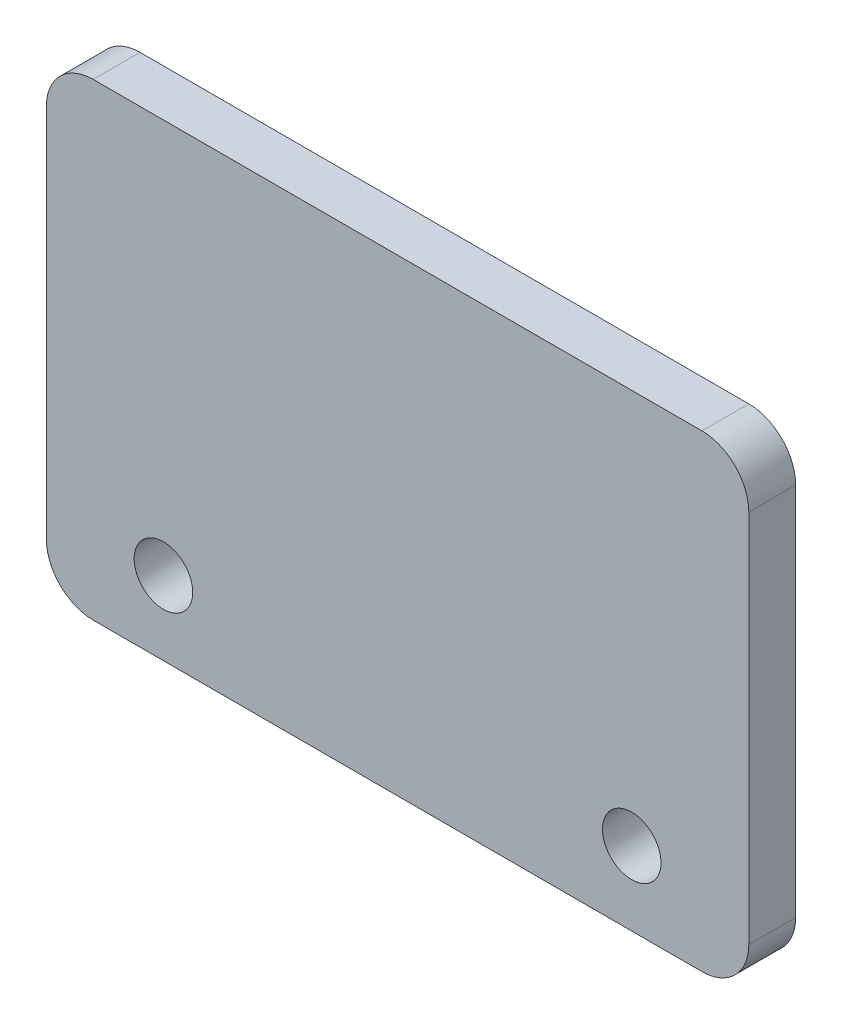
ISO-10303-21;
HEADER;
FILE_DESCRIPTION(('STEP AP214'),'2;1');
FILE_NAME('part.step','',(''),(''),'','','');
FILE_SCHEMA(('AUTOMOTIVE_DESIGN { 1 0 10303 214 1 1 1 1 }'));
ENDSEC;
DATA;
#1=APPLICATION_CONTEXT('core data for automotive mechanical design processes');
#2=APPLICATION_PROTOCOL_DEFINITION('international standard','automotive_design',2000,#1);
#3=PRODUCT_CONTEXT('',#1,'mechanical');
#4=PRODUCT('Part','Part','',(#3));
#5=PRODUCT_RELATED_PRODUCT_CATEGORY('part','',(#4));
#6=PRODUCT_DEFINITION_FORMATION('','',#4);
#7=PRODUCT_DEFINITION_CONTEXT('part definition',#1,'design');
#8=PRODUCT_DEFINITION('design','',#6,#7);
#9=PRODUCT_DEFINITION_SHAPE('','',#8);
#10=(LENGTH_UNIT() NAMED_UNIT(*) SI_UNIT(.MILLI.,.METRE.));
#11=(NAMED_UNIT(*) PLANE_ANGLE_UNIT() SI_UNIT($,.RADIAN.));
#12=(NAMED_UNIT(*) SI_UNIT($,.STERADIAN.) SOLID_ANGLE_UNIT());
#13=UNCERTAINTY_MEASURE_WITH_UNIT(LENGTH_MEASURE(1.E-05),#10,'distance_accuracy_value','');
#14=(GEOMETRIC_REPRESENTATION_CONTEXT(3) GLOBAL_UNCERTAINTY_ASSIGNED_CONTEXT((#13)) GLOBAL_UNIT_ASSIGNED_CONTEXT((#10,
#11,#12)) REPRESENTATION_CONTEXT('',''));
#15=CARTESIAN_POINT('',(0.,0.,0.));
#16=DIRECTION('',(0.,0.,1.));
#17=DIRECTION('',(1.,0.,0.));
#18=AXIS2_PLACEMENT_3D('',#15,#16,#17);
#19=CARTESIAN_POINT('',(15.,-10.,2.));
#20=DIRECTION('',(-1.,0.,0.));
#21=DIRECTION('',(0.,0.,1.));
#22=AXIS2_PLACEMENT_3D('',#19,#20,#21);
#23=PLANE('',#22);
#24=DIRECTION('',(0.,1.,0.));
#25=VECTOR('',#24,1.);
#26=CARTESIAN_POINT('',(15.,-10.,0.));
#27=LINE('',#26,#25);
#28=CARTESIAN_POINT('',(15.,-8.,0.));
#29=VERTEX_POINT('',#28);
#30=CARTESIAN_POINT('',(15.,8.,0.));
#31=VERTEX_POINT('',#30);
#32=EDGE_CURVE('E132',#29,#31,#27,.T.);
#33=ORIENTED_EDGE('',*,*,#32,.T.);
#34=DIRECTION('',(0.,0.,-1.));
#35=VECTOR('',#34,1.);
#36=CARTESIAN_POINT('',(15.,8.,2.));
#37=LINE('',#36,#35);
#38=CARTESIAN_POINT('',(15.,8.,2.));
#39=VERTEX_POINT('',#38);
#40=EDGE_CURVE('E154',#31,#39,#37,.F.);
#41=ORIENTED_EDGE('',*,*,#40,.T.);
#42=DIRECTION('',(0.,1.,0.));
#43=VECTOR('',#42,1.);
#44=CARTESIAN_POINT('',(15.,-10.,2.));
#45=LINE('',#44,#43);
#46=CARTESIAN_POINT('',(15.,-8.,2.));
#47=VERTEX_POINT('',#46);
#48=EDGE_CURVE('E130',#47,#39,#45,.T.);
#49=ORIENTED_EDGE('',*,*,#48,.F.);
#50=DIRECTION('',(0.,0.,-1.));
#51=VECTOR('',#50,1.);
#52=CARTESIAN_POINT('',(15.,-8.,2.));
#53=LINE('',#52,#51);
#54=EDGE_CURVE('E151',#47,#29,#53,.T.);
#55=ORIENTED_EDGE('',*,*,#54,.T.);
#56=EDGE_LOOP('',(#33,#41,#49,#55));
#57=FACE_BOUND('',#56,.T.);
#58=ADVANCED_FACE('F35',(#57),#23,.F.);
#59=CARTESIAN_POINT('',(-15.,10.,2.));
#60=DIRECTION('',(0.,-1.,0.));
#61=DIRECTION('',(0.,0.,-1.));
#62=AXIS2_PLACEMENT_3D('',#59,#60,#61);
#63=PLANE('',#62);
#64=DIRECTION('',(-1.,0.,0.));
#65=VECTOR('',#64,1.);
#66=CARTESIAN_POINT('',(-15.,10.,0.));
#67=LINE('',#66,#65);
#68=CARTESIAN_POINT('',(13.,10.,0.));
#69=VERTEX_POINT('',#68);
#70=CARTESIAN_POINT('',(-13.,10.,0.));
#71=VERTEX_POINT('',#70);
#72=EDGE_CURVE('E128',#69,#71,#67,.T.);
#73=ORIENTED_EDGE('',*,*,#72,.T.);
#74=DIRECTION('',(0.,0.,-1.));
#75=VECTOR('',#74,1.);
#76=CARTESIAN_POINT('',(-13.,10.,2.));
#77=LINE('',#76,#75);
#78=CARTESIAN_POINT('',(-13.,10.,2.));
#79=VERTEX_POINT('',#78);
#80=EDGE_CURVE('E106',#71,#79,#77,.F.);
#81=ORIENTED_EDGE('',*,*,#80,.T.);
#82=DIRECTION('',(-1.,0.,0.));
#83=VECTOR('',#82,1.);
#84=CARTESIAN_POINT('',(-15.,10.,2.));
#85=LINE('',#84,#83);
#86=CARTESIAN_POINT('',(13.,10.,2.));
#87=VERTEX_POINT('',#86);
#88=EDGE_CURVE('E168',#87,#79,#85,.T.);
#89=ORIENTED_EDGE('',*,*,#88,.F.);
#90=DIRECTION('',(0.,0.,-1.));
#91=VECTOR('',#90,1.);
#92=CARTESIAN_POINT('',(13.,10.,2.));
#93=LINE('',#92,#91);
#94=EDGE_CURVE('E111',#87,#69,#93,.T.);
#95=ORIENTED_EDGE('',*,*,#94,.T.);
#96=EDGE_LOOP('',(#73,#81,#89,#95));
#97=FACE_BOUND('',#96,.T.);
#98=ADVANCED_FACE('F173',(#97),#63,.F.);
#99=CARTESIAN_POINT('',(-15.,-10.,2.));
#100=DIRECTION('',(1.,0.,0.));
#101=DIRECTION('',(0.,0.,-1.));
#102=AXIS2_PLACEMENT_3D('',#99,#100,#101);
#103=PLANE('',#102);
#104=DIRECTION('',(0.,-1.,0.));
#105=VECTOR('',#104,1.);
#106=CARTESIAN_POINT('',(-15.,-10.,2.));
#107=LINE('',#106,#105);
#108=CARTESIAN_POINT('',(-15.,8.,2.));
#109=VERTEX_POINT('',#108);
#110=CARTESIAN_POINT('',(-15.,-8.,2.));
#111=VERTEX_POINT('',#110);
#112=EDGE_CURVE('E120',#109,#111,#107,.T.);
#113=ORIENTED_EDGE('',*,*,#112,.F.);
#114=DIRECTION('',(0.,0.,-1.));
#115=VECTOR('',#114,1.);
#116=CARTESIAN_POINT('',(-15.,8.,2.));
#117=LINE('',#116,#115);
#118=CARTESIAN_POINT('',(-15.,8.,0.));
#119=VERTEX_POINT('',#118);
#120=EDGE_CURVE('E105',#109,#119,#117,.T.);
#121=ORIENTED_EDGE('',*,*,#120,.T.);
#122=DIRECTION('',(0.,-1.,0.));
#123=VECTOR('',#122,1.);
#124=CARTESIAN_POINT('',(-15.,-10.,0.));
#125=LINE('',#124,#123);
#126=CARTESIAN_POINT('',(-15.,-8.,0.));
#127=VERTEX_POINT('',#126);
#128=EDGE_CURVE('E118',#119,#127,#125,.T.);
#129=ORIENTED_EDGE('',*,*,#128,.T.);
#130=DIRECTION('',(0.,0.,-1.));
#131=VECTOR('',#130,1.);
#132=CARTESIAN_POINT('',(-15.,-8.,2.));
#133=LINE('',#132,#131);
#134=EDGE_CURVE('E122',#127,#111,#133,.F.);
#135=ORIENTED_EDGE('',*,*,#134,.T.);
#136=EDGE_LOOP('',(#113,#121,#129,#135));
#137=FACE_BOUND('',#136,.T.);
#138=ADVANCED_FACE('F117',(#137),#103,.F.);
#139=CARTESIAN_POINT('',(-15.,-10.,2.));
#140=DIRECTION('',(0.,1.,0.));
#141=DIRECTION('',(0.,0.,1.));
#142=AXIS2_PLACEMENT_3D('',#139,#140,#141);
#143=PLANE('',#142);
#144=DIRECTION('',(1.,0.,0.));
#145=VECTOR('',#144,1.);
#146=CARTESIAN_POINT('',(-15.,-10.,2.));
#147=LINE('',#146,#145);
#148=CARTESIAN_POINT('',(-13.,-10.,2.));
#149=VERTEX_POINT('',#148);
#150=CARTESIAN_POINT('',(13.,-10.,2.));
#151=VERTEX_POINT('',#150);
#152=EDGE_CURVE('E136',#149,#151,#147,.T.);
#153=ORIENTED_EDGE('',*,*,#152,.F.);
#154=DIRECTION('',(0.,0.,-1.));
#155=VECTOR('',#154,1.);
#156=CARTESIAN_POINT('',(-13.,-10.,2.));
#157=LINE('',#156,#155);
#158=CARTESIAN_POINT('',(-13.,-10.,0.));
#159=VERTEX_POINT('',#158);
#160=EDGE_CURVE('E11',#149,#159,#157,.T.);
#161=ORIENTED_EDGE('',*,*,#160,.T.);
#162=DIRECTION('',(1.,0.,0.));
#163=VECTOR('',#162,1.);
#164=CARTESIAN_POINT('',(-15.,-10.,0.));
#165=LINE('',#164,#163);
#166=CARTESIAN_POINT('',(13.,-10.,0.));
#167=VERTEX_POINT('',#166);
#168=EDGE_CURVE('E127',#159,#167,#165,.T.);
#169=ORIENTED_EDGE('',*,*,#168,.T.);
#170=DIRECTION('',(0.,0.,-1.));
#171=VECTOR('',#170,1.);
#172=CARTESIAN_POINT('',(13.,-10.,2.));
#173=LINE('',#172,#171);
#174=EDGE_CURVE('E43',#167,#151,#173,.F.);
#175=ORIENTED_EDGE('',*,*,#174,.T.);
#176=EDGE_LOOP('',(#153,#161,#169,#175));
#177=FACE_BOUND('',#176,.T.);
#178=ADVANCED_FACE('F195',(#177),#143,.F.);
#179=CARTESIAN_POINT('',(0.,0.,2.));
#180=DIRECTION('',(0.,0.,-1.));
#181=DIRECTION('',(-1.,0.,0.));
#182=AXIS2_PLACEMENT_3D('',#179,#180,#181);
#183=PLANE('',#182);
#184=CARTESIAN_POINT('',(-10.,-6.85000000000008,2.));
#185=DIRECTION('',(0.,0.,1.));
#186=DIRECTION('',(1.,0.,0.));
#187=AXIS2_PLACEMENT_3D('',#184,#185,#186);
#188=CIRCLE('',#187,1.25);
#189=CARTESIAN_POINT('',(-8.75,-6.85000000000008,2.));
#190=VERTEX_POINT('',#189);
#191=EDGE_CURVE('E176',#190,#190,#188,.T.);
#192=ORIENTED_EDGE('',*,*,#191,.F.);
#193=EDGE_LOOP('',(#192));
#194=FACE_BOUND('',#193,.T.);
#195=CARTESIAN_POINT('',(10.,-6.85000000000008,2.));
#196=DIRECTION('',(0.,0.,1.));
#197=DIRECTION('',(1.,0.,0.));
#198=AXIS2_PLACEMENT_3D('',#195,#196,#197);
#199=CIRCLE('',#198,1.25);
#200=CARTESIAN_POINT('',(11.25,-6.85000000000008,2.));
#201=VERTEX_POINT('',#200);
#202=EDGE_CURVE('E182',#201,#201,#199,.T.);
#203=ORIENTED_EDGE('',*,*,#202,.F.);
#204=EDGE_LOOP('',(#203));
#205=FACE_BOUND('',#204,.T.);
#206=ORIENTED_EDGE('',*,*,#88,.T.);
#207=CARTESIAN_POINT('',(-13.,8.,2.));
#208=DIRECTION('',(0.,0.,-1.));
#209=DIRECTION('',(-1.,0.,0.));
#210=AXIS2_PLACEMENT_3D('',#207,#208,#209);
#211=CIRCLE('',#210,2.);
#212=EDGE_CURVE('E149',#79,#109,#211,.F.);
#213=ORIENTED_EDGE('',*,*,#212,.T.);
#214=ORIENTED_EDGE('',*,*,#112,.T.);
#215=CARTESIAN_POINT('',(-13.,-8.,2.));
#216=DIRECTION('',(0.,0.,-1.));
#217=DIRECTION('',(-1.,0.,0.));
#218=AXIS2_PLACEMENT_3D('',#215,#216,#217);
#219=CIRCLE('',#218,2.);
#220=EDGE_CURVE('E56',#111,#149,#219,.F.);
#221=ORIENTED_EDGE('',*,*,#220,.T.);
#222=ORIENTED_EDGE('',*,*,#152,.T.);
#223=CARTESIAN_POINT('',(13.,-8.,2.));
#224=DIRECTION('',(0.,0.,-1.));
#225=DIRECTION('',(-1.,0.,0.));
#226=AXIS2_PLACEMENT_3D('',#223,#224,#225);
#227=CIRCLE('',#226,2.);
#228=EDGE_CURVE('E144',#151,#47,#227,.F.);
#229=ORIENTED_EDGE('',*,*,#228,.T.);
#230=ORIENTED_EDGE('',*,*,#48,.T.);
#231=CARTESIAN_POINT('',(13.,8.,2.));
#232=DIRECTION('',(0.,0.,-1.));
#233=DIRECTION('',(-1.,0.,0.));
#234=AXIS2_PLACEMENT_3D('',#231,#232,#233);
#235=CIRCLE('',#234,2.);
#236=EDGE_CURVE('E147',#39,#87,#235,.F.);
#237=ORIENTED_EDGE('',*,*,#236,.T.);
#238=EDGE_LOOP('',(#206,#213,#214,#221,#222,#229,#230,#237));
#239=FACE_BOUND('',#238,.T.);
#240=ADVANCED_FACE('F165',(#194,#205,#239),#183,.F.);
#241=CARTESIAN_POINT('',(0.,0.,0.));
#242=DIRECTION('',(0.,0.,-1.));
#243=DIRECTION('',(-1.,0.,0.));
#244=AXIS2_PLACEMENT_3D('',#241,#242,#243);
#245=PLANE('',#244);
#246=CARTESIAN_POINT('',(-10.,-6.85000000000008,0.));
#247=DIRECTION('',(0.,0.,1.));
#248=DIRECTION('',(1.,0.,0.));
#249=AXIS2_PLACEMENT_3D('',#246,#247,#248);
#250=CIRCLE('',#249,1.25);
#251=CARTESIAN_POINT('',(-8.75,-6.85000000000008,0.));
#252=VERTEX_POINT('',#251);
#253=EDGE_CURVE('E174',#252,#252,#250,.T.);
#254=ORIENTED_EDGE('',*,*,#253,.T.);
#255=EDGE_LOOP('',(#254));
#256=FACE_BOUND('',#255,.T.);
#257=CARTESIAN_POINT('',(10.,-6.85000000000008,0.));
#258=DIRECTION('',(0.,0.,1.));
#259=DIRECTION('',(1.,0.,0.));
#260=AXIS2_PLACEMENT_3D('',#257,#258,#259);
#261=CIRCLE('',#260,1.25);
#262=CARTESIAN_POINT('',(11.25,-6.85000000000008,0.));
#263=VERTEX_POINT('',#262);
#264=EDGE_CURVE('E185',#263,#263,#261,.T.);
#265=ORIENTED_EDGE('',*,*,#264,.T.);
#266=EDGE_LOOP('',(#265));
#267=FACE_BOUND('',#266,.T.);
#268=ORIENTED_EDGE('',*,*,#128,.F.);
#269=CARTESIAN_POINT('',(-13.,8.,0.));
#270=DIRECTION('',(0.,0.,-1.));
#271=DIRECTION('',(-1.,0.,0.));
#272=AXIS2_PLACEMENT_3D('',#269,#270,#271);
#273=CIRCLE('',#272,2.);
#274=EDGE_CURVE('E101',#119,#71,#273,.T.);
#275=ORIENTED_EDGE('',*,*,#274,.T.);
#276=ORIENTED_EDGE('',*,*,#72,.F.);
#277=CARTESIAN_POINT('',(13.,8.,0.));
#278=DIRECTION('',(0.,0.,-1.));
#279=DIRECTION('',(-1.,0.,0.));
#280=AXIS2_PLACEMENT_3D('',#277,#278,#279);
#281=CIRCLE('',#280,2.);
#282=EDGE_CURVE('E112',#69,#31,#281,.T.);
#283=ORIENTED_EDGE('',*,*,#282,.T.);
#284=ORIENTED_EDGE('',*,*,#32,.F.);
#285=CARTESIAN_POINT('',(13.,-8.,0.));
#286=DIRECTION('',(0.,0.,-1.));
#287=DIRECTION('',(-1.,0.,0.));
#288=AXIS2_PLACEMENT_3D('',#285,#286,#287);
#289=CIRCLE('',#288,2.);
#290=EDGE_CURVE('E121',#29,#167,#289,.T.);
#291=ORIENTED_EDGE('',*,*,#290,.T.);
#292=ORIENTED_EDGE('',*,*,#168,.F.);
#293=CARTESIAN_POINT('',(-13.,-8.,0.));
#294=DIRECTION('',(0.,0.,-1.));
#295=DIRECTION('',(-1.,0.,0.));
#296=AXIS2_PLACEMENT_3D('',#293,#294,#295);
#297=CIRCLE('',#296,2.);
#298=EDGE_CURVE('E126',#159,#127,#297,.T.);
#299=ORIENTED_EDGE('',*,*,#298,.T.);
#300=EDGE_LOOP('',(#268,#275,#276,#283,#284,#291,#292,#299));
#301=FACE_BOUND('',#300,.T.);
#302=ADVANCED_FACE('F124',(#256,#267,#301),#245,.T.);
#303=CARTESIAN_POINT('',(10.,-6.85000000000008,0.));
#304=DIRECTION('',(0.,0.,1.));
#305=DIRECTION('',(1.,0.,0.));
#306=AXIS2_PLACEMENT_3D('',#303,#304,#305);
#307=CYLINDRICAL_SURFACE('',#306,1.25);
#308=ORIENTED_EDGE('',*,*,#264,.F.);
#309=EDGE_LOOP('',(#308));
#310=FACE_BOUND('',#309,.T.);
#311=ORIENTED_EDGE('',*,*,#202,.T.);
#312=EDGE_LOOP('',(#311));
#313=FACE_BOUND('',#312,.T.);
#314=ADVANCED_FACE('F199',(#310,#313),#307,.F.);
#315=CARTESIAN_POINT('',(-10.,-6.85000000000008,0.));
#316=DIRECTION('',(0.,0.,1.));
#317=DIRECTION('',(1.,0.,0.));
#318=AXIS2_PLACEMENT_3D('',#315,#316,#317);
#319=CYLINDRICAL_SURFACE('',#318,1.25);
#320=ORIENTED_EDGE('',*,*,#253,.F.);
#321=EDGE_LOOP('',(#320));
#322=FACE_BOUND('',#321,.T.);
#323=ORIENTED_EDGE('',*,*,#191,.T.);
#324=EDGE_LOOP('',(#323));
#325=FACE_BOUND('',#324,.T.);
#326=ADVANCED_FACE('F191',(#322,#325),#319,.F.);
#327=CARTESIAN_POINT('',(-13.,8.,2.));
#328=DIRECTION('',(0.,0.,-1.));
#329=DIRECTION('',(-1.,0.,0.));
#330=AXIS2_PLACEMENT_3D('',#327,#328,#329);
#331=CYLINDRICAL_SURFACE('',#330,2.);
#332=ORIENTED_EDGE('',*,*,#212,.F.);
#333=ORIENTED_EDGE('',*,*,#80,.F.);
#334=ORIENTED_EDGE('',*,*,#274,.F.);
#335=ORIENTED_EDGE('',*,*,#120,.F.);
#336=EDGE_LOOP('',(#332,#333,#334,#335));
#337=FACE_BOUND('',#336,.T.);
#338=ADVANCED_FACE('F104',(#337),#331,.T.);
#339=CARTESIAN_POINT('',(13.,8.,2.));
#340=DIRECTION('',(0.,0.,-1.));
#341=DIRECTION('',(-1.,0.,0.));
#342=AXIS2_PLACEMENT_3D('',#339,#340,#341);
#343=CYLINDRICAL_SURFACE('',#342,2.);
#344=ORIENTED_EDGE('',*,*,#236,.F.);
#345=ORIENTED_EDGE('',*,*,#40,.F.);
#346=ORIENTED_EDGE('',*,*,#282,.F.);
#347=ORIENTED_EDGE('',*,*,#94,.F.);
#348=EDGE_LOOP('',(#344,#345,#346,#347));
#349=FACE_BOUND('',#348,.T.);
#350=ADVANCED_FACE('F171',(#349),#343,.T.);
#351=CARTESIAN_POINT('',(-13.,-8.,2.));
#352=DIRECTION('',(0.,0.,-1.));
#353=DIRECTION('',(-1.,0.,0.));
#354=AXIS2_PLACEMENT_3D('',#351,#352,#353);
#355=CYLINDRICAL_SURFACE('',#354,2.);
#356=ORIENTED_EDGE('',*,*,#220,.F.);
#357=ORIENTED_EDGE('',*,*,#134,.F.);
#358=ORIENTED_EDGE('',*,*,#298,.F.);
#359=ORIENTED_EDGE('',*,*,#160,.F.);
#360=EDGE_LOOP('',(#356,#357,#358,#359));
#361=FACE_BOUND('',#360,.T.);
#362=ADVANCED_FACE('F225',(#361),#355,.T.);
#363=CARTESIAN_POINT('',(13.,-8.,2.));
#364=DIRECTION('',(0.,0.,-1.));
#365=DIRECTION('',(-1.,0.,0.));
#366=AXIS2_PLACEMENT_3D('',#363,#364,#365);
#367=CYLINDRICAL_SURFACE('',#366,2.);
#368=ORIENTED_EDGE('',*,*,#228,.F.);
#369=ORIENTED_EDGE('',*,*,#174,.F.);
#370=ORIENTED_EDGE('',*,*,#290,.F.);
#371=ORIENTED_EDGE('',*,*,#54,.F.);
#372=EDGE_LOOP('',(#368,#369,#370,#371));
#373=FACE_BOUND('',#372,.T.);
#374=ADVANCED_FACE('F37',(#373),#367,.T.);
#375=CLOSED_SHELL('',(#58,#98,#138,#178,#240,#302,#314,#326,#338,#350,#362,#374));
#376=MANIFOLD_SOLID_BREP('B2',#375);
#377=ADVANCED_BREP_SHAPE_REPRESENTATION('',(#18,#376),#14);
#378=SHAPE_DEFINITION_REPRESENTATION(#9,#377);
ENDSEC;
END-ISO-10303-21;
